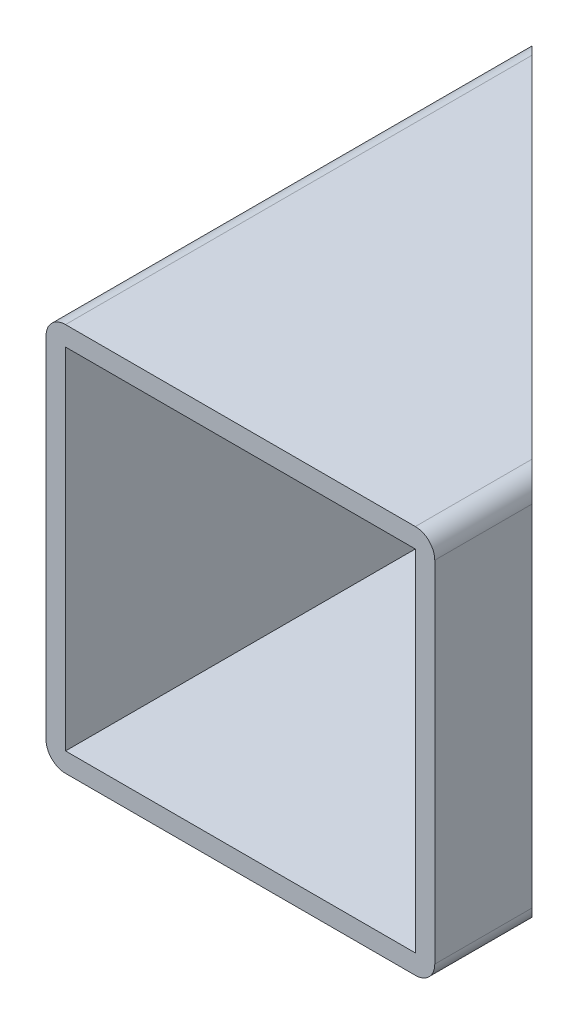
ISO-10303-21;
HEADER;
FILE_DESCRIPTION(('STEP AP214'),'2;1');
FILE_NAME('part.step','',(''),(''),'','','');
FILE_SCHEMA(('AUTOMOTIVE_DESIGN { 1 0 10303 214 1 1 1 1 }'));
ENDSEC;
DATA;
#1=APPLICATION_CONTEXT('core data for automotive mechanical design processes');
#2=APPLICATION_PROTOCOL_DEFINITION('international standard','automotive_design',2000,#1);
#3=PRODUCT_CONTEXT('',#1,'mechanical');
#4=PRODUCT('Part','Part','',(#3));
#5=PRODUCT_RELATED_PRODUCT_CATEGORY('part','',(#4));
#6=PRODUCT_DEFINITION_FORMATION('','',#4);
#7=PRODUCT_DEFINITION_CONTEXT('part definition',#1,'design');
#8=PRODUCT_DEFINITION('design','',#6,#7);
#9=PRODUCT_DEFINITION_SHAPE('','',#8);
#10=(LENGTH_UNIT() NAMED_UNIT(*) SI_UNIT(.MILLI.,.METRE.));
#11=(NAMED_UNIT(*) PLANE_ANGLE_UNIT() SI_UNIT($,.RADIAN.));
#12=(NAMED_UNIT(*) SI_UNIT($,.STERADIAN.) SOLID_ANGLE_UNIT());
#13=UNCERTAINTY_MEASURE_WITH_UNIT(LENGTH_MEASURE(1.E-05),#10,'distance_accuracy_value','');
#14=(GEOMETRIC_REPRESENTATION_CONTEXT(3) GLOBAL_UNCERTAINTY_ASSIGNED_CONTEXT((#13)) GLOBAL_UNIT_ASSIGNED_CONTEXT((#10,
#11,#12)) REPRESENTATION_CONTEXT('',''));
#15=CARTESIAN_POINT('',(0.,0.,0.));
#16=DIRECTION('',(0.,0.,1.));
#17=DIRECTION('',(1.,0.,0.));
#18=AXIS2_PLACEMENT_3D('',#15,#16,#17);
#19=CARTESIAN_POINT('',(36.,-36.,100.));
#20=DIRECTION('',(0.,0.,-1.));
#21=DIRECTION('',(-1.,0.,0.));
#22=AXIS2_PLACEMENT_3D('',#19,#20,#21);
#23=CYLINDRICAL_SURFACE('',#22,4.);
#24=CARTESIAN_POINT('',(36.,-36.,75.9999999999991));
#25=DIRECTION('',(0.707106781186543,0.,-0.707106781186552));
#26=DIRECTION('',(-0.707106781186552,0.,-0.707106781186543));
#27=AXIS2_PLACEMENT_3D('',#24,#25,#26);
#28=ELLIPSE('',#27,5.65685424949234,4.);
#29=CARTESIAN_POINT('',(40.,-36.,79.9999999999991));
#30=VERTEX_POINT('',#29);
#31=CARTESIAN_POINT('',(36.,-40.,75.9999999999991));
#32=VERTEX_POINT('',#31);
#33=EDGE_CURVE('E48',#30,#32,#28,.T.);
#34=ORIENTED_EDGE('',*,*,#33,.F.);
#35=DIRECTION('',(0.,0.,-1.));
#36=VECTOR('',#35,1.);
#37=CARTESIAN_POINT('',(40.,-36.,100.));
#38=LINE('',#37,#36);
#39=CARTESIAN_POINT('',(40.,-36.,100.));
#40=VERTEX_POINT('',#39);
#41=EDGE_CURVE('E41',#40,#30,#38,.T.);
#42=ORIENTED_EDGE('',*,*,#41,.F.);
#43=CARTESIAN_POINT('',(36.,-36.,100.));
#44=DIRECTION('',(0.,0.,1.));
#45=DIRECTION('',(-1.,0.,0.));
#46=AXIS2_PLACEMENT_3D('',#43,#44,#45);
#47=CIRCLE('',#46,4.);
#48=CARTESIAN_POINT('',(36.,-40.,100.));
#49=VERTEX_POINT('',#48);
#50=EDGE_CURVE('E130',#49,#40,#47,.T.);
#51=ORIENTED_EDGE('',*,*,#50,.F.);
#52=DIRECTION('',(0.,0.,-1.));
#53=VECTOR('',#52,1.);
#54=CARTESIAN_POINT('',(36.,-40.,100.));
#55=LINE('',#54,#53);
#56=EDGE_CURVE('E171',#49,#32,#55,.T.);
#57=ORIENTED_EDGE('',*,*,#56,.T.);
#58=EDGE_LOOP('',(#34,#42,#51,#57));
#59=FACE_BOUND('',#58,.T.);
#60=ADVANCED_FACE('F34',(#59),#23,.T.);
#61=CARTESIAN_POINT('',(40.,36.,100.));
#62=DIRECTION('',(-1.,0.,0.));
#63=DIRECTION('',(0.,0.,1.));
#64=AXIS2_PLACEMENT_3D('',#61,#62,#63);
#65=PLANE('',#64);
#66=DIRECTION('',(0.,-1.,0.));
#67=VECTOR('',#66,1.);
#68=CARTESIAN_POINT('',(40.,67.,79.9999999999991));
#69=LINE('',#68,#67);
#70=CARTESIAN_POINT('',(40.,36.,79.9999999999991));
#71=VERTEX_POINT('',#70);
#72=EDGE_CURVE('E164',#71,#30,#69,.T.);
#73=ORIENTED_EDGE('',*,*,#72,.F.);
#74=DIRECTION('',(0.,0.,-1.));
#75=VECTOR('',#74,1.);
#76=CARTESIAN_POINT('',(40.,36.,100.));
#77=LINE('',#76,#75);
#78=CARTESIAN_POINT('',(40.,36.,100.));
#79=VERTEX_POINT('',#78);
#80=EDGE_CURVE('E156',#79,#71,#77,.T.);
#81=ORIENTED_EDGE('',*,*,#80,.F.);
#82=DIRECTION('',(0.,1.,0.));
#83=VECTOR('',#82,1.);
#84=CARTESIAN_POINT('',(40.,36.,100.));
#85=LINE('',#84,#83);
#86=EDGE_CURVE('E165',#40,#79,#85,.T.);
#87=ORIENTED_EDGE('',*,*,#86,.F.);
#88=ORIENTED_EDGE('',*,*,#41,.T.);
#89=EDGE_LOOP('',(#73,#81,#87,#88));
#90=FACE_BOUND('',#89,.T.);
#91=ADVANCED_FACE('F162',(#90),#65,.F.);
#92=CARTESIAN_POINT('',(36.,36.,100.));
#93=DIRECTION('',(0.,0.,-1.));
#94=DIRECTION('',(-1.,0.,0.));
#95=AXIS2_PLACEMENT_3D('',#92,#93,#94);
#96=CYLINDRICAL_SURFACE('',#95,4.);
#97=CARTESIAN_POINT('',(36.,36.,75.9999999999991));
#98=DIRECTION('',(0.707106781186543,0.,-0.707106781186552));
#99=DIRECTION('',(-0.707106781186552,0.,-0.707106781186543));
#100=AXIS2_PLACEMENT_3D('',#97,#98,#99);
#101=ELLIPSE('',#100,5.65685424949234,4.);
#102=CARTESIAN_POINT('',(36.,40.,75.9999999999991));
#103=VERTEX_POINT('',#102);
#104=EDGE_CURVE('E178',#103,#71,#101,.T.);
#105=ORIENTED_EDGE('',*,*,#104,.F.);
#106=DIRECTION('',(0.,0.,-1.));
#107=VECTOR('',#106,1.);
#108=CARTESIAN_POINT('',(36.,40.,100.));
#109=LINE('',#108,#107);
#110=CARTESIAN_POINT('',(36.,40.,100.));
#111=VERTEX_POINT('',#110);
#112=EDGE_CURVE('E148',#111,#103,#109,.T.);
#113=ORIENTED_EDGE('',*,*,#112,.F.);
#114=CARTESIAN_POINT('',(36.,36.,100.));
#115=DIRECTION('',(0.,0.,1.));
#116=DIRECTION('',(-1.,0.,0.));
#117=AXIS2_PLACEMENT_3D('',#114,#115,#116);
#118=CIRCLE('',#117,4.);
#119=EDGE_CURVE('E202',#79,#111,#118,.T.);
#120=ORIENTED_EDGE('',*,*,#119,.F.);
#121=ORIENTED_EDGE('',*,*,#80,.T.);
#122=EDGE_LOOP('',(#105,#113,#120,#121));
#123=FACE_BOUND('',#122,.T.);
#124=ADVANCED_FACE('F231',(#123),#96,.T.);
#125=CARTESIAN_POINT('',(-36.,40.,100.));
#126=DIRECTION('',(0.,-1.,0.));
#127=DIRECTION('',(0.,0.,-1.));
#128=AXIS2_PLACEMENT_3D('',#125,#126,#127);
#129=PLANE('',#128);
#130=DIRECTION('',(0.707106781186552,0.,0.707106781186543));
#131=VECTOR('',#130,1.);
#132=CARTESIAN_POINT('',(12.0000000000001,40.,51.9999999999994));
#133=LINE('',#132,#131);
#134=CARTESIAN_POINT('',(-36.,40.,3.99999999999999));
#135=VERTEX_POINT('',#134);
#136=EDGE_CURVE('E142',#135,#103,#133,.T.);
#137=ORIENTED_EDGE('',*,*,#136,.F.);
#138=DIRECTION('',(0.,0.,-1.));
#139=VECTOR('',#138,1.);
#140=CARTESIAN_POINT('',(-36.,40.,100.));
#141=LINE('',#140,#139);
#142=CARTESIAN_POINT('',(-36.,40.,100.));
#143=VERTEX_POINT('',#142);
#144=EDGE_CURVE('E141',#143,#135,#141,.T.);
#145=ORIENTED_EDGE('',*,*,#144,.F.);
#146=DIRECTION('',(-1.,0.,0.));
#147=VECTOR('',#146,1.);
#148=CARTESIAN_POINT('',(-36.,40.,100.));
#149=LINE('',#148,#147);
#150=EDGE_CURVE('E204',#111,#143,#149,.T.);
#151=ORIENTED_EDGE('',*,*,#150,.F.);
#152=ORIENTED_EDGE('',*,*,#112,.T.);
#153=EDGE_LOOP('',(#137,#145,#151,#152));
#154=FACE_BOUND('',#153,.T.);
#155=ADVANCED_FACE('F228',(#154),#129,.F.);
#156=CARTESIAN_POINT('',(-36.,36.,100.));
#157=DIRECTION('',(0.,0.,-1.));
#158=DIRECTION('',(-1.,0.,0.));
#159=AXIS2_PLACEMENT_3D('',#156,#157,#158);
#160=CYLINDRICAL_SURFACE('',#159,4.);
#161=CARTESIAN_POINT('',(-36.,36.,3.99999999999995));
#162=DIRECTION('',(0.707106781186543,0.,-0.707106781186552));
#163=DIRECTION('',(-0.707106781186552,0.,-0.707106781186543));
#164=AXIS2_PLACEMENT_3D('',#161,#162,#163);
#165=ELLIPSE('',#164,5.65685424949234,4.);
#166=CARTESIAN_POINT('',(-40.,36.,0.));
#167=VERTEX_POINT('',#166);
#168=EDGE_CURVE('E122',#167,#135,#165,.T.);
#169=ORIENTED_EDGE('',*,*,#168,.F.);
#170=DIRECTION('',(0.,0.,-1.));
#171=VECTOR('',#170,1.);
#172=CARTESIAN_POINT('',(-40.,36.,100.));
#173=LINE('',#172,#171);
#174=CARTESIAN_POINT('',(-40.,36.,100.));
#175=VERTEX_POINT('',#174);
#176=EDGE_CURVE('E138',#175,#167,#173,.T.);
#177=ORIENTED_EDGE('',*,*,#176,.F.);
#178=CARTESIAN_POINT('',(-36.,36.,100.));
#179=DIRECTION('',(0.,0.,1.));
#180=DIRECTION('',(1.,0.,0.));
#181=AXIS2_PLACEMENT_3D('',#178,#179,#180);
#182=CIRCLE('',#181,4.);
#183=EDGE_CURVE('E206',#143,#175,#182,.T.);
#184=ORIENTED_EDGE('',*,*,#183,.F.);
#185=ORIENTED_EDGE('',*,*,#144,.T.);
#186=EDGE_LOOP('',(#169,#177,#184,#185));
#187=FACE_BOUND('',#186,.T.);
#188=ADVANCED_FACE('F136',(#187),#160,.T.);
#189=CARTESIAN_POINT('',(-36.,-36.,100.));
#190=DIRECTION('',(0.,0.,-1.));
#191=DIRECTION('',(-1.,0.,0.));
#192=AXIS2_PLACEMENT_3D('',#189,#190,#191);
#193=CYLINDRICAL_SURFACE('',#192,4.);
#194=CARTESIAN_POINT('',(-36.,-36.,3.99999999999998));
#195=DIRECTION('',(0.707106781186543,0.,-0.707106781186552));
#196=DIRECTION('',(-0.707106781186552,0.,-0.707106781186543));
#197=AXIS2_PLACEMENT_3D('',#194,#195,#196);
#198=ELLIPSE('',#197,5.65685424949234,4.);
#199=CARTESIAN_POINT('',(-36.,-40.,3.99999999999999));
#200=VERTEX_POINT('',#199);
#201=CARTESIAN_POINT('',(-40.,-36.,0.));
#202=VERTEX_POINT('',#201);
#203=EDGE_CURVE('E125',#200,#202,#198,.T.);
#204=ORIENTED_EDGE('',*,*,#203,.F.);
#205=DIRECTION('',(0.,0.,-1.));
#206=VECTOR('',#205,1.);
#207=CARTESIAN_POINT('',(-35.9999999999999,-40.,100.));
#208=LINE('',#207,#206);
#209=CARTESIAN_POINT('',(-35.9999999999999,-40.,100.));
#210=VERTEX_POINT('',#209);
#211=EDGE_CURVE('E150',#210,#200,#208,.T.);
#212=ORIENTED_EDGE('',*,*,#211,.F.);
#213=CARTESIAN_POINT('',(-36.,-36.,100.));
#214=DIRECTION('',(0.,0.,1.));
#215=DIRECTION('',(1.,0.,0.));
#216=AXIS2_PLACEMENT_3D('',#213,#214,#215);
#217=CIRCLE('',#216,4.);
#218=CARTESIAN_POINT('',(-40.,-36.,100.));
#219=VERTEX_POINT('',#218);
#220=EDGE_CURVE('E209',#219,#210,#217,.T.);
#221=ORIENTED_EDGE('',*,*,#220,.F.);
#222=DIRECTION('',(0.,0.,-1.));
#223=VECTOR('',#222,1.);
#224=CARTESIAN_POINT('',(-40.,-36.,100.));
#225=LINE('',#224,#223);
#226=EDGE_CURVE('E146',#219,#202,#225,.T.);
#227=ORIENTED_EDGE('',*,*,#226,.T.);
#228=EDGE_LOOP('',(#204,#212,#221,#227));
#229=FACE_BOUND('',#228,.T.);
#230=ADVANCED_FACE('F220',(#229),#193,.T.);
#231=CARTESIAN_POINT('',(-35.9999999999999,-40.,100.));
#232=DIRECTION('',(0.,1.,0.));
#233=DIRECTION('',(0.,0.,1.));
#234=AXIS2_PLACEMENT_3D('',#231,#232,#233);
#235=PLANE('',#234);
#236=DIRECTION('',(-0.707106781186552,0.,-0.707106781186543));
#237=VECTOR('',#236,1.);
#238=CARTESIAN_POINT('',(12.0000000000001,-40.,51.9999999999994));
#239=LINE('',#238,#237);
#240=EDGE_CURVE('E173',#32,#200,#239,.T.);
#241=ORIENTED_EDGE('',*,*,#240,.F.);
#242=ORIENTED_EDGE('',*,*,#56,.F.);
#243=DIRECTION('',(1.,0.,0.));
#244=VECTOR('',#243,1.);
#245=CARTESIAN_POINT('',(-35.9999999999999,-40.,100.));
#246=LINE('',#245,#244);
#247=EDGE_CURVE('E211',#210,#49,#246,.T.);
#248=ORIENTED_EDGE('',*,*,#247,.F.);
#249=ORIENTED_EDGE('',*,*,#211,.T.);
#250=EDGE_LOOP('',(#241,#242,#248,#249));
#251=FACE_BOUND('',#250,.T.);
#252=ADVANCED_FACE('F217',(#251),#235,.F.);
#253=CARTESIAN_POINT('',(-36.,36.,100.));
#254=DIRECTION('',(0.,-1.,0.));
#255=DIRECTION('',(1.,0.,0.));
#256=AXIS2_PLACEMENT_3D('',#253,#254,#255);
#257=PLANE('',#256);
#258=DIRECTION('',(0.,0.,-1.));
#259=VECTOR('',#258,1.);
#260=CARTESIAN_POINT('',(-36.,36.,100.));
#261=LINE('',#260,#259);
#262=CARTESIAN_POINT('',(-36.,36.,100.));
#263=VERTEX_POINT('',#262);
#264=CARTESIAN_POINT('',(-36.,36.,3.99999999999998));
#265=VERTEX_POINT('',#264);
#266=EDGE_CURVE('E131',#263,#265,#261,.T.);
#267=ORIENTED_EDGE('',*,*,#266,.T.);
#268=DIRECTION('',(0.707106781186552,0.,0.707106781186543));
#269=VECTOR('',#268,1.);
#270=CARTESIAN_POINT('',(12.0000000000001,36.,51.9999999999994));
#271=LINE('',#270,#269);
#272=CARTESIAN_POINT('',(36.,36.,75.9999999999991));
#273=VERTEX_POINT('',#272);
#274=EDGE_CURVE('E353',#265,#273,#271,.T.);
#275=ORIENTED_EDGE('',*,*,#274,.T.);
#276=DIRECTION('',(0.,0.,-1.));
#277=VECTOR('',#276,1.);
#278=CARTESIAN_POINT('',(36.,36.,100.));
#279=LINE('',#278,#277);
#280=CARTESIAN_POINT('',(36.,36.,100.));
#281=VERTEX_POINT('',#280);
#282=EDGE_CURVE('E189',#281,#273,#279,.T.);
#283=ORIENTED_EDGE('',*,*,#282,.F.);
#284=DIRECTION('',(-1.,0.,0.));
#285=VECTOR('',#284,1.);
#286=CARTESIAN_POINT('',(-36.,36.,100.));
#287=LINE('',#286,#285);
#288=EDGE_CURVE('E180',#281,#263,#287,.T.);
#289=ORIENTED_EDGE('',*,*,#288,.T.);
#290=EDGE_LOOP('',(#267,#275,#283,#289));
#291=FACE_BOUND('',#290,.T.);
#292=ADVANCED_FACE('F282',(#291),#257,.T.);
#293=CARTESIAN_POINT('',(-36.,36.,100.));
#294=DIRECTION('',(1.,0.,0.));
#295=DIRECTION('',(0.,0.,-1.));
#296=AXIS2_PLACEMENT_3D('',#293,#294,#295);
#297=PLANE('',#296);
#298=DIRECTION('',(0.,0.,-1.));
#299=VECTOR('',#298,1.);
#300=CARTESIAN_POINT('',(-36.,-36.,100.));
#301=LINE('',#300,#299);
#302=CARTESIAN_POINT('',(-36.,-36.,100.));
#303=VERTEX_POINT('',#302);
#304=CARTESIAN_POINT('',(-36.,-36.,3.99999999999998));
#305=VERTEX_POINT('',#304);
#306=EDGE_CURVE('E195',#303,#305,#301,.T.);
#307=ORIENTED_EDGE('',*,*,#306,.T.);
#308=DIRECTION('',(0.,1.,0.));
#309=VECTOR('',#308,1.);
#310=CARTESIAN_POINT('',(-36.,36.,3.99999999999998));
#311=LINE('',#310,#309);
#312=EDGE_CURVE('E351',#305,#265,#311,.T.);
#313=ORIENTED_EDGE('',*,*,#312,.T.);
#314=ORIENTED_EDGE('',*,*,#266,.F.);
#315=DIRECTION('',(0.,-1.,0.));
#316=VECTOR('',#315,1.);
#317=CARTESIAN_POINT('',(-36.,36.,100.));
#318=LINE('',#317,#316);
#319=EDGE_CURVE('E182',#263,#303,#318,.T.);
#320=ORIENTED_EDGE('',*,*,#319,.T.);
#321=EDGE_LOOP('',(#307,#313,#314,#320));
#322=FACE_BOUND('',#321,.T.);
#323=ADVANCED_FACE('F291',(#322),#297,.T.);
#324=CARTESIAN_POINT('',(-36.,-36.,100.));
#325=DIRECTION('',(0.,1.,0.));
#326=DIRECTION('',(-1.,0.,0.));
#327=AXIS2_PLACEMENT_3D('',#324,#325,#326);
#328=PLANE('',#327);
#329=DIRECTION('',(0.,0.,-1.));
#330=VECTOR('',#329,1.);
#331=CARTESIAN_POINT('',(36.,-36.,100.));
#332=LINE('',#331,#330);
#333=CARTESIAN_POINT('',(36.,-36.,100.));
#334=VERTEX_POINT('',#333);
#335=CARTESIAN_POINT('',(36.,-36.,75.9999999999991));
#336=VERTEX_POINT('',#335);
#337=EDGE_CURVE('E192',#334,#336,#332,.T.);
#338=ORIENTED_EDGE('',*,*,#337,.T.);
#339=DIRECTION('',(-0.707106781186552,0.,-0.707106781186543));
#340=VECTOR('',#339,1.);
#341=CARTESIAN_POINT('',(12.,-36.,51.9999999999994));
#342=LINE('',#341,#340);
#343=EDGE_CURVE('E56',#336,#305,#342,.T.);
#344=ORIENTED_EDGE('',*,*,#343,.T.);
#345=ORIENTED_EDGE('',*,*,#306,.F.);
#346=DIRECTION('',(1.,0.,0.));
#347=VECTOR('',#346,1.);
#348=CARTESIAN_POINT('',(-36.,-36.,100.));
#349=LINE('',#348,#347);
#350=EDGE_CURVE('E184',#303,#334,#349,.T.);
#351=ORIENTED_EDGE('',*,*,#350,.T.);
#352=EDGE_LOOP('',(#338,#344,#345,#351));
#353=FACE_BOUND('',#352,.T.);
#354=ADVANCED_FACE('F301',(#353),#328,.T.);
#355=CARTESIAN_POINT('',(36.,36.,100.));
#356=DIRECTION('',(-1.,0.,0.));
#357=DIRECTION('',(0.,-1.,0.));
#358=AXIS2_PLACEMENT_3D('',#355,#356,#357);
#359=PLANE('',#358);
#360=ORIENTED_EDGE('',*,*,#282,.T.);
#361=DIRECTION('',(0.,-1.,0.));
#362=VECTOR('',#361,1.);
#363=CARTESIAN_POINT('',(36.,36.,75.9999999999991));
#364=LINE('',#363,#362);
#365=EDGE_CURVE('E11',#273,#336,#364,.T.);
#366=ORIENTED_EDGE('',*,*,#365,.T.);
#367=ORIENTED_EDGE('',*,*,#337,.F.);
#368=DIRECTION('',(0.,1.,0.));
#369=VECTOR('',#368,1.);
#370=CARTESIAN_POINT('',(36.,36.,100.));
#371=LINE('',#370,#369);
#372=EDGE_CURVE('E187',#334,#281,#371,.T.);
#373=ORIENTED_EDGE('',*,*,#372,.T.);
#374=EDGE_LOOP('',(#360,#366,#367,#373));
#375=FACE_BOUND('',#374,.T.);
#376=ADVANCED_FACE('F311',(#375),#359,.T.);
#377=CARTESIAN_POINT('',(36.,-36.,100.));
#378=DIRECTION('',(0.,0.,-1.));
#379=DIRECTION('',(-1.,0.,0.));
#380=AXIS2_PLACEMENT_3D('',#377,#378,#379);
#381=PLANE('',#380);
#382=ORIENTED_EDGE('',*,*,#50,.T.);
#383=ORIENTED_EDGE('',*,*,#86,.T.);
#384=ORIENTED_EDGE('',*,*,#119,.T.);
#385=ORIENTED_EDGE('',*,*,#150,.T.);
#386=ORIENTED_EDGE('',*,*,#183,.T.);
#387=DIRECTION('',(0.,-1.,0.));
#388=VECTOR('',#387,1.);
#389=CARTESIAN_POINT('',(-40.,36.,100.));
#390=LINE('',#389,#388);
#391=EDGE_CURVE('E145',#175,#219,#390,.T.);
#392=ORIENTED_EDGE('',*,*,#391,.T.);
#393=ORIENTED_EDGE('',*,*,#220,.T.);
#394=ORIENTED_EDGE('',*,*,#247,.T.);
#395=EDGE_LOOP('',(#382,#383,#384,#385,#386,#392,#393,#394));
#396=FACE_BOUND('',#395,.T.);
#397=ORIENTED_EDGE('',*,*,#288,.F.);
#398=ORIENTED_EDGE('',*,*,#372,.F.);
#399=ORIENTED_EDGE('',*,*,#350,.F.);
#400=ORIENTED_EDGE('',*,*,#319,.F.);
#401=EDGE_LOOP('',(#397,#398,#399,#400));
#402=FACE_BOUND('',#401,.T.);
#403=ADVANCED_FACE('F222',(#396,#402),#381,.F.);
#404=CARTESIAN_POINT('',(-40.,36.,100.));
#405=DIRECTION('',(1.,0.,0.));
#406=DIRECTION('',(0.,1.,0.));
#407=AXIS2_PLACEMENT_3D('',#404,#405,#406);
#408=PLANE('',#407);
#409=DIRECTION('',(0.,-1.,0.));
#410=VECTOR('',#409,1.);
#411=CARTESIAN_POINT('',(-40.,36.,0.));
#412=LINE('',#411,#410);
#413=EDGE_CURVE('E119',#167,#202,#412,.T.);
#414=ORIENTED_EDGE('',*,*,#413,.T.);
#415=ORIENTED_EDGE('',*,*,#226,.F.);
#416=ORIENTED_EDGE('',*,*,#391,.F.);
#417=ORIENTED_EDGE('',*,*,#176,.T.);
#418=EDGE_LOOP('',(#414,#415,#416,#417));
#419=FACE_BOUND('',#418,.T.);
#420=ADVANCED_FACE('F144',(#419),#408,.F.);
#421=CARTESIAN_POINT('',(-40.,67.,0.));
#422=DIRECTION('',(0.707106781186543,0.,-0.707106781186552));
#423=DIRECTION('',(-0.707106781186552,0.,-0.707106781186543));
#424=AXIS2_PLACEMENT_3D('',#421,#422,#423);
#425=PLANE('',#424);
#426=ORIENTED_EDGE('',*,*,#312,.F.);
#427=ORIENTED_EDGE('',*,*,#343,.F.);
#428=ORIENTED_EDGE('',*,*,#365,.F.);
#429=ORIENTED_EDGE('',*,*,#274,.F.);
#430=EDGE_LOOP('',(#426,#427,#428,#429));
#431=FACE_BOUND('',#430,.T.);
#432=ORIENTED_EDGE('',*,*,#104,.T.);
#433=ORIENTED_EDGE('',*,*,#72,.T.);
#434=ORIENTED_EDGE('',*,*,#33,.T.);
#435=ORIENTED_EDGE('',*,*,#240,.T.);
#436=ORIENTED_EDGE('',*,*,#203,.T.);
#437=ORIENTED_EDGE('',*,*,#413,.F.);
#438=ORIENTED_EDGE('',*,*,#168,.T.);
#439=ORIENTED_EDGE('',*,*,#136,.T.);
#440=EDGE_LOOP('',(#432,#433,#434,#435,#436,#437,#438,#439));
#441=FACE_BOUND('',#440,.T.);
#442=ADVANCED_FACE('F121',(#431,#441),#425,.T.);
#443=CLOSED_SHELL('',(#60,#91,#124,#155,#188,#230,#252,#292,#323,#354,#376,#403,#420,#442));
#444=MANIFOLD_SOLID_BREP('B2',#443);
#445=ADVANCED_BREP_SHAPE_REPRESENTATION('',(#18,#444),#14);
#446=SHAPE_DEFINITION_REPRESENTATION(#9,#445);
ENDSEC;
END-ISO-10303-21;
